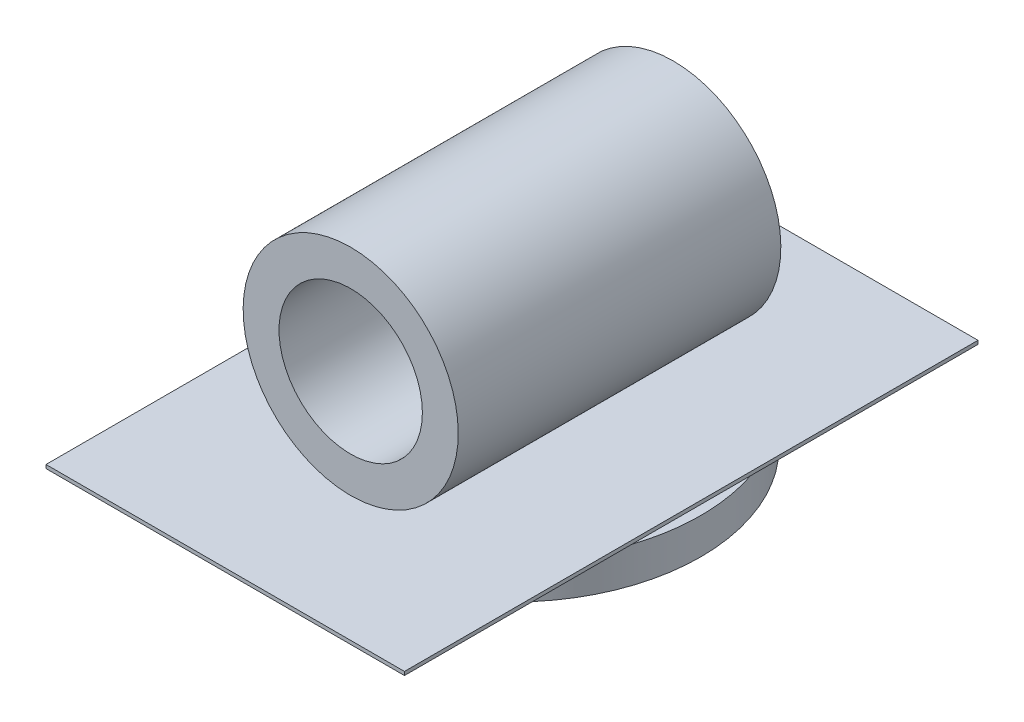
ISO-10303-21;
HEADER;
FILE_DESCRIPTION(('STEP AP214'),'2;1');
FILE_NAME('part.step','',(''),(''),'','','');
FILE_SCHEMA(('AUTOMOTIVE_DESIGN { 1 0 10303 214 1 1 1 1 }'));
ENDSEC;
DATA;
#1=APPLICATION_CONTEXT('core data for automotive mechanical design processes');
#2=APPLICATION_PROTOCOL_DEFINITION('international standard','automotive_design',2000,#1);
#3=PRODUCT_CONTEXT('',#1,'mechanical');
#4=PRODUCT('Part','Part','',(#3));
#5=PRODUCT_RELATED_PRODUCT_CATEGORY('part','',(#4));
#6=PRODUCT_DEFINITION_FORMATION('','',#4);
#7=PRODUCT_DEFINITION_CONTEXT('part definition',#1,'design');
#8=PRODUCT_DEFINITION('design','',#6,#7);
#9=PRODUCT_DEFINITION_SHAPE('','',#8);
#10=(LENGTH_UNIT() NAMED_UNIT(*) SI_UNIT(.MILLI.,.METRE.));
#11=(NAMED_UNIT(*) PLANE_ANGLE_UNIT() SI_UNIT($,.RADIAN.));
#12=(NAMED_UNIT(*) SI_UNIT($,.STERADIAN.) SOLID_ANGLE_UNIT());
#13=UNCERTAINTY_MEASURE_WITH_UNIT(LENGTH_MEASURE(1.E-05),#10,'distance_accuracy_value','');
#14=(GEOMETRIC_REPRESENTATION_CONTEXT(3) GLOBAL_UNCERTAINTY_ASSIGNED_CONTEXT((#13)) GLOBAL_UNIT_ASSIGNED_CONTEXT((#10,
#11,#12)) REPRESENTATION_CONTEXT('',''));
#15=CARTESIAN_POINT('',(0.,0.,0.));
#16=DIRECTION('',(0.,0.,1.));
#17=DIRECTION('',(1.,0.,0.));
#18=AXIS2_PLACEMENT_3D('',#15,#16,#17);
#19=CARTESIAN_POINT('',(0.,0.,0.));
#20=DIRECTION('',(0.,-1.,0.));
#21=DIRECTION('',(0.,0.,-1.));
#22=AXIS2_PLACEMENT_3D('',#19,#20,#21);
#23=PLANE('',#22);
#24=CARTESIAN_POINT('',(0.,0.,0.));
#25=DIRECTION('',(0.,-1.,0.));
#26=DIRECTION('',(0.,0.,-1.));
#27=AXIS2_PLACEMENT_3D('',#24,#25,#26);
#28=CIRCLE('',#27,26.3355904944601);
#29=CARTESIAN_POINT('',(25.,0.,8.28029750020487));
#30=VERTEX_POINT('',#29);
#31=CARTESIAN_POINT('',(-25.,0.,8.28029750020493));
#32=VERTEX_POINT('',#31);
#33=EDGE_CURVE('E138',#30,#32,#28,.T.);
#34=ORIENTED_EDGE('',*,*,#33,.F.);
#35=DIRECTION('',(0.,0.,-1.));
#36=VECTOR('',#35,1.);
#37=CARTESIAN_POINT('',(25.,0.,40.));
#38=LINE('',#37,#36);
#39=CARTESIAN_POINT('',(25.,0.,40.));
#40=VERTEX_POINT('',#39);
#41=EDGE_CURVE('E115',#40,#30,#38,.T.);
#42=ORIENTED_EDGE('',*,*,#41,.F.);
#43=DIRECTION('',(-1.,0.,0.));
#44=VECTOR('',#43,1.);
#45=CARTESIAN_POINT('',(25.,0.,40.));
#46=LINE('',#45,#44);
#47=CARTESIAN_POINT('',(-25.,0.,40.));
#48=VERTEX_POINT('',#47);
#49=EDGE_CURVE('E147',#40,#48,#46,.T.);
#50=ORIENTED_EDGE('',*,*,#49,.T.);
#51=DIRECTION('',(0.,0.,-1.));
#52=VECTOR('',#51,1.);
#53=CARTESIAN_POINT('',(-25.,0.,40.));
#54=LINE('',#53,#52);
#55=EDGE_CURVE('E171',#48,#32,#54,.T.);
#56=ORIENTED_EDGE('',*,*,#55,.T.);
#57=EDGE_LOOP('',(#34,#42,#50,#56));
#58=FACE_BOUND('',#57,.T.);
#59=ADVANCED_FACE('F45',(#58),#23,.T.);
#60=CARTESIAN_POINT('',(25.,0.5,40.));
#61=DIRECTION('',(0.,0.,1.));
#62=DIRECTION('',(1.,0.,0.));
#63=AXIS2_PLACEMENT_3D('',#60,#61,#62);
#64=PLANE('',#63);
#65=ORIENTED_EDGE('',*,*,#49,.F.);
#66=DIRECTION('',(0.,-1.,0.));
#67=VECTOR('',#66,1.);
#68=CARTESIAN_POINT('',(25.,0.5,40.));
#69=LINE('',#68,#67);
#70=CARTESIAN_POINT('',(25.,0.5,40.));
#71=VERTEX_POINT('',#70);
#72=EDGE_CURVE('E139',#71,#40,#69,.T.);
#73=ORIENTED_EDGE('',*,*,#72,.F.);
#74=DIRECTION('',(-1.,0.,0.));
#75=VECTOR('',#74,1.);
#76=CARTESIAN_POINT('',(25.,0.5,40.));
#77=LINE('',#76,#75);
#78=CARTESIAN_POINT('',(-25.,0.5,40.));
#79=VERTEX_POINT('',#78);
#80=EDGE_CURVE('E152',#71,#79,#77,.T.);
#81=ORIENTED_EDGE('',*,*,#80,.T.);
#82=DIRECTION('',(0.,-1.,0.));
#83=VECTOR('',#82,1.);
#84=CARTESIAN_POINT('',(-25.,0.5,40.));
#85=LINE('',#84,#83);
#86=EDGE_CURVE('E166',#79,#48,#85,.T.);
#87=ORIENTED_EDGE('',*,*,#86,.T.);
#88=EDGE_LOOP('',(#65,#73,#81,#87));
#89=FACE_BOUND('',#88,.T.);
#90=ADVANCED_FACE('F47',(#89),#64,.T.);
#91=CARTESIAN_POINT('',(25.,0.5,40.));
#92=DIRECTION('',(-1.,0.,0.));
#93=DIRECTION('',(0.,0.,1.));
#94=AXIS2_PLACEMENT_3D('',#91,#92,#93);
#95=PLANE('',#94);
#96=ORIENTED_EDGE('',*,*,#41,.T.);
#97=CARTESIAN_POINT('',(25.,0.,-8.28029750020487));
#98=VERTEX_POINT('',#97);
#99=EDGE_CURVE('E108',#30,#98,#38,.T.);
#100=ORIENTED_EDGE('',*,*,#99,.T.);
#101=CARTESIAN_POINT('',(25.,0.,-40.));
#102=VERTEX_POINT('',#101);
#103=EDGE_CURVE('E112',#98,#102,#38,.T.);
#104=ORIENTED_EDGE('',*,*,#103,.T.);
#105=DIRECTION('',(0.,-1.,0.));
#106=VECTOR('',#105,1.);
#107=CARTESIAN_POINT('',(25.,0.5,-40.));
#108=LINE('',#107,#106);
#109=CARTESIAN_POINT('',(25.,0.5,-40.));
#110=VERTEX_POINT('',#109);
#111=EDGE_CURVE('E181',#110,#102,#108,.T.);
#112=ORIENTED_EDGE('',*,*,#111,.F.);
#113=DIRECTION('',(0.,0.,-1.));
#114=VECTOR('',#113,1.);
#115=CARTESIAN_POINT('',(25.,0.5,40.));
#116=LINE('',#115,#114);
#117=EDGE_CURVE('E163',#71,#110,#116,.T.);
#118=ORIENTED_EDGE('',*,*,#117,.F.);
#119=ORIENTED_EDGE('',*,*,#72,.T.);
#120=EDGE_LOOP('',(#96,#100,#104,#112,#118,#119));
#121=FACE_BOUND('',#120,.T.);
#122=ADVANCED_FACE('F110',(#121),#95,.F.);
#123=CARTESIAN_POINT('',(25.,0.5,-40.));
#124=DIRECTION('',(0.,0.,1.));
#125=DIRECTION('',(1.,0.,0.));
#126=AXIS2_PLACEMENT_3D('',#123,#124,#125);
#127=PLANE('',#126);
#128=DIRECTION('',(-1.,0.,0.));
#129=VECTOR('',#128,1.);
#130=CARTESIAN_POINT('',(25.,0.,-40.));
#131=LINE('',#130,#129);
#132=CARTESIAN_POINT('',(-25.,0.,-40.));
#133=VERTEX_POINT('',#132);
#134=EDGE_CURVE('E128',#102,#133,#131,.T.);
#135=ORIENTED_EDGE('',*,*,#134,.T.);
#136=DIRECTION('',(0.,-1.,0.));
#137=VECTOR('',#136,1.);
#138=CARTESIAN_POINT('',(-25.,0.5,-40.));
#139=LINE('',#138,#137);
#140=CARTESIAN_POINT('',(-25.,0.5,-40.));
#141=VERTEX_POINT('',#140);
#142=EDGE_CURVE('E184',#141,#133,#139,.T.);
#143=ORIENTED_EDGE('',*,*,#142,.F.);
#144=DIRECTION('',(-1.,0.,0.));
#145=VECTOR('',#144,1.);
#146=CARTESIAN_POINT('',(25.,0.5,-40.));
#147=LINE('',#146,#145);
#148=EDGE_CURVE('E160',#110,#141,#147,.T.);
#149=ORIENTED_EDGE('',*,*,#148,.F.);
#150=ORIENTED_EDGE('',*,*,#111,.T.);
#151=EDGE_LOOP('',(#135,#143,#149,#150));
#152=FACE_BOUND('',#151,.T.);
#153=ADVANCED_FACE('F215',(#152),#127,.F.);
#154=CARTESIAN_POINT('',(-25.,0.5,40.));
#155=DIRECTION('',(-1.,0.,0.));
#156=DIRECTION('',(0.,0.,1.));
#157=AXIS2_PLACEMENT_3D('',#154,#155,#156);
#158=PLANE('',#157);
#159=ORIENTED_EDGE('',*,*,#55,.F.);
#160=ORIENTED_EDGE('',*,*,#86,.F.);
#161=DIRECTION('',(0.,0.,-1.));
#162=VECTOR('',#161,1.);
#163=CARTESIAN_POINT('',(-25.,0.5,40.));
#164=LINE('',#163,#162);
#165=EDGE_CURVE('E156',#79,#141,#164,.T.);
#166=ORIENTED_EDGE('',*,*,#165,.T.);
#167=ORIENTED_EDGE('',*,*,#142,.T.);
#168=CARTESIAN_POINT('',(-25.,0.,-8.28029750020493));
#169=VERTEX_POINT('',#168);
#170=EDGE_CURVE('E170',#169,#133,#54,.T.);
#171=ORIENTED_EDGE('',*,*,#170,.F.);
#172=EDGE_CURVE('E175',#32,#169,#54,.T.);
#173=ORIENTED_EDGE('',*,*,#172,.F.);
#174=EDGE_LOOP('',(#159,#160,#166,#167,#171,#173));
#175=FACE_BOUND('',#174,.T.);
#176=ADVANCED_FACE('F211',(#175),#158,.T.);
#177=CARTESIAN_POINT('',(0.,0.5,0.));
#178=DIRECTION('',(0.,-1.,0.));
#179=DIRECTION('',(0.,0.,-1.));
#180=AXIS2_PLACEMENT_3D('',#177,#178,#179);
#181=PLANE('',#180);
#182=DIRECTION('',(0.,0.,-1.));
#183=VECTOR('',#182,1.);
#184=CARTESIAN_POINT('',(0.383964822076508,0.5,22.5));
#185=LINE('',#184,#183);
#186=CARTESIAN_POINT('',(0.383964822076508,0.5,22.5));
#187=VERTEX_POINT('',#186);
#188=CARTESIAN_POINT('',(0.383964822076508,0.5,-22.5));
#189=VERTEX_POINT('',#188);
#190=EDGE_CURVE('E65',#187,#189,#185,.T.);
#191=ORIENTED_EDGE('',*,*,#190,.F.);
#192=DIRECTION('',(1.,0.,0.));
#193=VECTOR('',#192,1.);
#194=CARTESIAN_POINT('',(0.,0.5,22.5));
#195=LINE('',#194,#193);
#196=CARTESIAN_POINT('',(-0.383964822076508,0.5,22.5));
#197=VERTEX_POINT('',#196);
#198=EDGE_CURVE('E11',#187,#197,#195,.F.);
#199=ORIENTED_EDGE('',*,*,#198,.T.);
#200=DIRECTION('',(0.,0.,-1.));
#201=VECTOR('',#200,1.);
#202=CARTESIAN_POINT('',(-0.383964822076508,0.5,22.5));
#203=LINE('',#202,#201);
#204=CARTESIAN_POINT('',(-0.383964822076508,0.5,-22.5));
#205=VERTEX_POINT('',#204);
#206=EDGE_CURVE('E55',#205,#197,#203,.F.);
#207=ORIENTED_EDGE('',*,*,#206,.F.);
#208=DIRECTION('',(1.,0.,0.));
#209=VECTOR('',#208,1.);
#210=CARTESIAN_POINT('',(0.,0.5,-22.5));
#211=LINE('',#210,#209);
#212=EDGE_CURVE('E192',#189,#205,#211,.F.);
#213=ORIENTED_EDGE('',*,*,#212,.F.);
#214=EDGE_LOOP('',(#191,#199,#207,#213));
#215=FACE_BOUND('',#214,.T.);
#216=ORIENTED_EDGE('',*,*,#80,.F.);
#217=ORIENTED_EDGE('',*,*,#117,.T.);
#218=ORIENTED_EDGE('',*,*,#148,.T.);
#219=ORIENTED_EDGE('',*,*,#165,.F.);
#220=EDGE_LOOP('',(#216,#217,#218,#219));
#221=FACE_BOUND('',#220,.T.);
#222=ADVANCED_FACE('F219',(#215,#221),#181,.F.);
#223=EDGE_CURVE('E125',#169,#98,#28,.T.);
#224=ORIENTED_EDGE('',*,*,#223,.F.);
#225=ORIENTED_EDGE('',*,*,#170,.T.);
#226=ORIENTED_EDGE('',*,*,#134,.F.);
#227=ORIENTED_EDGE('',*,*,#103,.F.);
#228=EDGE_LOOP('',(#224,#225,#226,#227));
#229=FACE_BOUND('',#228,.T.);
#230=ADVANCED_FACE('F124',(#229),#23,.T.);
#231=CARTESIAN_POINT('',(0.,0.,0.));
#232=DIRECTION('',(0.,-1.,0.));
#233=DIRECTION('',(0.,0.,-1.));
#234=AXIS2_PLACEMENT_3D('',#231,#232,#233);
#235=PLANE('',#234);
#236=EDGE_CURVE('E136',#32,#169,#28,.T.);
#237=ORIENTED_EDGE('',*,*,#236,.F.);
#238=ORIENTED_EDGE('',*,*,#172,.T.);
#239=EDGE_LOOP('',(#237,#238));
#240=FACE_BOUND('',#239,.T.);
#241=ADVANCED_FACE('F207',(#240),#235,.F.);
#242=CARTESIAN_POINT('',(0.,-5.,0.));
#243=DIRECTION('',(0.,1.,0.));
#244=DIRECTION('',(0.,0.,1.));
#245=AXIS2_PLACEMENT_3D('',#242,#243,#244);
#246=CYLINDRICAL_SURFACE('',#245,26.3355904944601);
#247=CARTESIAN_POINT('',(0.,-5.,0.));
#248=DIRECTION('',(0.,-1.,0.));
#249=DIRECTION('',(0.,0.,-1.));
#250=AXIS2_PLACEMENT_3D('',#247,#248,#249);
#251=CIRCLE('',#250,26.3355904944601);
#252=CARTESIAN_POINT('',(0.,-5.,-26.3355904944601));
#253=VERTEX_POINT('',#252);
#254=EDGE_CURVE('E143',#253,#253,#251,.T.);
#255=ORIENTED_EDGE('',*,*,#254,.F.);
#256=EDGE_LOOP('',(#255));
#257=FACE_BOUND('',#256,.T.);
#258=EDGE_CURVE('E134',#98,#30,#28,.T.);
#259=ORIENTED_EDGE('',*,*,#258,.T.);
#260=ORIENTED_EDGE('',*,*,#33,.T.);
#261=ORIENTED_EDGE('',*,*,#236,.T.);
#262=ORIENTED_EDGE('',*,*,#223,.T.);
#263=EDGE_LOOP('',(#259,#260,#261,#262));
#264=FACE_BOUND('',#263,.T.);
#265=ADVANCED_FACE('F132',(#257,#264),#246,.T.);
#266=CARTESIAN_POINT('',(0.,-5.,0.));
#267=DIRECTION('',(0.,-1.,0.));
#268=DIRECTION('',(0.,0.,-1.));
#269=AXIS2_PLACEMENT_3D('',#266,#267,#268);
#270=PLANE('',#269);
#271=ORIENTED_EDGE('',*,*,#254,.T.);
#272=EDGE_LOOP('',(#271));
#273=FACE_BOUND('',#272,.T.);
#274=ADVANCED_FACE('F245',(#273),#270,.T.);
#275=ORIENTED_EDGE('',*,*,#99,.F.);
#276=ORIENTED_EDGE('',*,*,#258,.F.);
#277=EDGE_LOOP('',(#275,#276));
#278=FACE_BOUND('',#277,.T.);
#279=ADVANCED_FACE('F141',(#278),#235,.F.);
#280=CARTESIAN_POINT('',(0.,15.4950848952384,22.5));
#281=DIRECTION('',(0.,0.,-1.));
#282=DIRECTION('',(-1.,0.,0.));
#283=AXIS2_PLACEMENT_3D('',#280,#281,#282);
#284=CYLINDRICAL_SURFACE('',#283,15.);
#285=CARTESIAN_POINT('',(0.,15.4950848952384,-22.5));
#286=DIRECTION('',(0.,0.,1.));
#287=DIRECTION('',(1.,0.,0.));
#288=AXIS2_PLACEMENT_3D('',#285,#286,#287);
#289=CIRCLE('',#288,15.);
#290=EDGE_CURVE('E274',#189,#205,#289,.T.);
#291=ORIENTED_EDGE('',*,*,#290,.T.);
#292=ORIENTED_EDGE('',*,*,#206,.T.);
#293=CARTESIAN_POINT('',(0.,15.4950848952384,22.5));
#294=DIRECTION('',(0.,0.,1.));
#295=DIRECTION('',(1.,0.,0.));
#296=AXIS2_PLACEMENT_3D('',#293,#294,#295);
#297=CIRCLE('',#296,15.);
#298=EDGE_CURVE('E149',#187,#197,#297,.T.);
#299=ORIENTED_EDGE('',*,*,#298,.F.);
#300=ORIENTED_EDGE('',*,*,#190,.T.);
#301=EDGE_LOOP('',(#291,#292,#299,#300));
#302=FACE_BOUND('',#301,.T.);
#303=ADVANCED_FACE('F248',(#302),#284,.T.);
#304=CARTESIAN_POINT('',(0.,15.4950848952384,22.5));
#305=DIRECTION('',(0.,0.,1.));
#306=DIRECTION('',(1.,0.,0.));
#307=AXIS2_PLACEMENT_3D('',#304,#305,#306);
#308=PLANE('',#307);
#309=CARTESIAN_POINT('',(0.,15.4983426161976,22.5));
#310=DIRECTION('',(0.,0.,1.));
#311=DIRECTION('',(1.,0.,0.));
#312=AXIS2_PLACEMENT_3D('',#309,#310,#311);
#313=CIRCLE('',#312,10.);
#314=CARTESIAN_POINT('',(10.,15.4983426161976,22.5));
#315=VERTEX_POINT('',#314);
#316=EDGE_CURVE('E270',#315,#315,#313,.T.);
#317=ORIENTED_EDGE('',*,*,#316,.F.);
#318=EDGE_LOOP('',(#317));
#319=FACE_BOUND('',#318,.T.);
#320=ORIENTED_EDGE('',*,*,#198,.F.);
#321=ORIENTED_EDGE('',*,*,#298,.T.);
#322=EDGE_LOOP('',(#320,#321));
#323=FACE_BOUND('',#322,.T.);
#324=ADVANCED_FACE('F253',(#319,#323),#308,.T.);
#325=CARTESIAN_POINT('',(0.,15.4950848952384,-22.5));
#326=DIRECTION('',(0.,0.,1.));
#327=DIRECTION('',(1.,0.,0.));
#328=AXIS2_PLACEMENT_3D('',#325,#326,#327);
#329=PLANE('',#328);
#330=CARTESIAN_POINT('',(0.,15.4983426161976,-22.5));
#331=DIRECTION('',(0.,0.,1.));
#332=DIRECTION('',(1.,0.,0.));
#333=AXIS2_PLACEMENT_3D('',#330,#331,#332);
#334=CIRCLE('',#333,10.);
#335=CARTESIAN_POINT('',(10.,15.4983426161976,-22.5));
#336=VERTEX_POINT('',#335);
#337=EDGE_CURVE('E49',#336,#336,#334,.T.);
#338=ORIENTED_EDGE('',*,*,#337,.T.);
#339=EDGE_LOOP('',(#338));
#340=FACE_BOUND('',#339,.T.);
#341=ORIENTED_EDGE('',*,*,#290,.F.);
#342=ORIENTED_EDGE('',*,*,#212,.T.);
#343=EDGE_LOOP('',(#341,#342));
#344=FACE_BOUND('',#343,.T.);
#345=ADVANCED_FACE('F255',(#340,#344),#329,.F.);
#346=CARTESIAN_POINT('',(0.,15.4983426161976,-40.));
#347=DIRECTION('',(0.,0.,1.));
#348=DIRECTION('',(1.,0.,0.));
#349=AXIS2_PLACEMENT_3D('',#346,#347,#348);
#350=CYLINDRICAL_SURFACE('',#349,10.);
#351=ORIENTED_EDGE('',*,*,#316,.T.);
#352=EDGE_LOOP('',(#351));
#353=FACE_BOUND('',#352,.T.);
#354=ORIENTED_EDGE('',*,*,#337,.F.);
#355=EDGE_LOOP('',(#354));
#356=FACE_BOUND('',#355,.T.);
#357=ADVANCED_FACE('F258',(#353,#356),#350,.F.);
#358=CLOSED_SHELL('',(#59,#90,#122,#153,#176,#222,#230,#241,#265,#274,#279,#303,#324,#345,#357));
#359=MANIFOLD_SOLID_BREP('B2',#358);
#360=ADVANCED_BREP_SHAPE_REPRESENTATION('',(#18,#359),#14);
#361=SHAPE_DEFINITION_REPRESENTATION(#9,#360);
ENDSEC;
END-ISO-10303-21;
